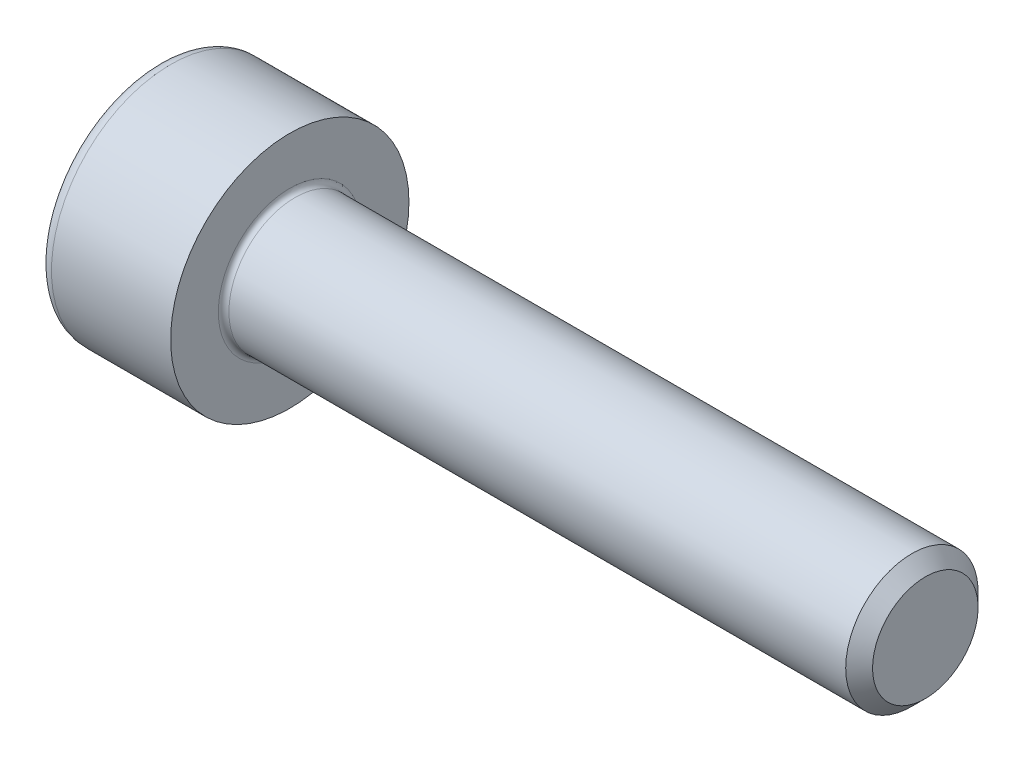
ISO-10303-21;
HEADER;
FILE_DESCRIPTION(('STEP AP214'),'2;1');
FILE_NAME('part.step','',(''),(''),'','','');
FILE_SCHEMA(('AUTOMOTIVE_DESIGN { 1 0 10303 214 1 1 1 1 }'));
ENDSEC;
DATA;
#1=APPLICATION_CONTEXT('core data for automotive mechanical design processes');
#2=APPLICATION_PROTOCOL_DEFINITION('international standard','automotive_design',2000,#1);
#3=PRODUCT_CONTEXT('',#1,'mechanical');
#4=PRODUCT('Part','Part','',(#3));
#5=PRODUCT_RELATED_PRODUCT_CATEGORY('part','',(#4));
#6=PRODUCT_DEFINITION_FORMATION('','',#4);
#7=PRODUCT_DEFINITION_CONTEXT('part definition',#1,'design');
#8=PRODUCT_DEFINITION('design','',#6,#7);
#9=PRODUCT_DEFINITION_SHAPE('','',#8);
#10=(LENGTH_UNIT() NAMED_UNIT(*) SI_UNIT(.MILLI.,.METRE.));
#11=(NAMED_UNIT(*) PLANE_ANGLE_UNIT() SI_UNIT($,.RADIAN.));
#12=(NAMED_UNIT(*) SI_UNIT($,.STERADIAN.) SOLID_ANGLE_UNIT());
#13=UNCERTAINTY_MEASURE_WITH_UNIT(LENGTH_MEASURE(1.E-05),#10,'distance_accuracy_value','');
#14=(GEOMETRIC_REPRESENTATION_CONTEXT(3) GLOBAL_UNCERTAINTY_ASSIGNED_CONTEXT((#13)) GLOBAL_UNIT_ASSIGNED_CONTEXT((#10,
#11,#12)) REPRESENTATION_CONTEXT('',''));
#15=CARTESIAN_POINT('',(0.,0.,0.));
#16=DIRECTION('',(0.,0.,1.));
#17=DIRECTION('',(1.,0.,0.));
#18=AXIS2_PLACEMENT_3D('',#15,#16,#17);
#19=CARTESIAN_POINT('',(1.1,1.15470053837925,0.));
#20=DIRECTION('',(1.,0.,0.));
#21=DIRECTION('',(0.,0.,-1.));
#22=AXIS2_PLACEMENT_3D('',#19,#20,#21);
#23=PLANE('',#22);
#24=CARTESIAN_POINT('',(1.1,0.,0.));
#25=DIRECTION('',(1.,0.,0.));
#26=DIRECTION('',(0.,0.,-1.));
#27=AXIS2_PLACEMENT_3D('',#24,#25,#26);
#28=CIRCLE('',#27,1.);
#29=CARTESIAN_POINT('',(1.1,0.,-0.999999999999999));
#30=VERTEX_POINT('',#29);
#31=CARTESIAN_POINT('',(1.1,-0.866025403784441,-0.5));
#32=VERTEX_POINT('',#31);
#33=EDGE_CURVE('E156',#30,#32,#28,.F.);
#34=ORIENTED_EDGE('',*,*,#33,.F.);
#35=DIRECTION('',(0.,1.,0.));
#36=VECTOR('',#35,1.);
#37=CARTESIAN_POINT('',(1.1,-0.57735026918963,-0.999999999999999));
#38=LINE('',#37,#36);
#39=CARTESIAN_POINT('',(1.1,-0.57735026918963,-0.999999999999999));
#40=VERTEX_POINT('',#39);
#41=EDGE_CURVE('E187',#40,#30,#38,.T.);
#42=ORIENTED_EDGE('',*,*,#41,.F.);
#43=DIRECTION('',(0.,0.499999999999999,-0.866025403784439));
#44=VECTOR('',#43,1.);
#45=CARTESIAN_POINT('',(1.1,-1.15470053837926,0.));
#46=LINE('',#45,#44);
#47=EDGE_CURVE('E183',#32,#40,#46,.T.);
#48=ORIENTED_EDGE('',*,*,#47,.F.);
#49=EDGE_LOOP('',(#34,#42,#48));
#50=FACE_BOUND('',#49,.T.);
#51=ADVANCED_FACE('F34',(#50),#23,.F.);
#52=CARTESIAN_POINT('',(1.1,-0.866025403784442,0.500000000000002));
#53=VERTEX_POINT('',#52);
#54=EDGE_CURVE('E262',#32,#53,#28,.F.);
#55=ORIENTED_EDGE('',*,*,#54,.F.);
#56=CARTESIAN_POINT('',(1.1,-1.15470053837926,0.));
#57=VERTEX_POINT('',#56);
#58=EDGE_CURVE('E184',#57,#32,#46,.T.);
#59=ORIENTED_EDGE('',*,*,#58,.F.);
#60=DIRECTION('',(0.,-0.5,-0.866025403784439));
#61=VECTOR('',#60,1.);
#62=CARTESIAN_POINT('',(1.1,-0.57735026918963,1.));
#63=LINE('',#62,#61);
#64=EDGE_CURVE('E179',#53,#57,#63,.T.);
#65=ORIENTED_EDGE('',*,*,#64,.F.);
#66=EDGE_LOOP('',(#55,#59,#65));
#67=FACE_BOUND('',#66,.T.);
#68=ADVANCED_FACE('F123',(#67),#23,.F.);
#69=CARTESIAN_POINT('',(1.1,0.,1.));
#70=VERTEX_POINT('',#69);
#71=EDGE_CURVE('E263',#53,#70,#28,.F.);
#72=ORIENTED_EDGE('',*,*,#71,.F.);
#73=CARTESIAN_POINT('',(1.1,-0.57735026918963,1.));
#74=VERTEX_POINT('',#73);
#75=EDGE_CURVE('E180',#74,#53,#63,.T.);
#76=ORIENTED_EDGE('',*,*,#75,.F.);
#77=DIRECTION('',(0.,-1.,0.));
#78=VECTOR('',#77,1.);
#79=CARTESIAN_POINT('',(1.1,0.577350269189625,1.));
#80=LINE('',#79,#78);
#81=EDGE_CURVE('E175',#70,#74,#80,.T.);
#82=ORIENTED_EDGE('',*,*,#81,.F.);
#83=EDGE_LOOP('',(#72,#76,#82));
#84=FACE_BOUND('',#83,.T.);
#85=ADVANCED_FACE('F129',(#84),#23,.F.);
#86=CARTESIAN_POINT('',(1.1,0.866025403784438,0.5));
#87=VERTEX_POINT('',#86);
#88=EDGE_CURVE('E265',#70,#87,#28,.F.);
#89=ORIENTED_EDGE('',*,*,#88,.F.);
#90=CARTESIAN_POINT('',(1.1,0.577350269189625,1.));
#91=VERTEX_POINT('',#90);
#92=EDGE_CURVE('E176',#91,#70,#80,.T.);
#93=ORIENTED_EDGE('',*,*,#92,.F.);
#94=DIRECTION('',(0.,-0.5,0.866025403784438));
#95=VECTOR('',#94,1.);
#96=CARTESIAN_POINT('',(1.1,1.15470053837925,0.));
#97=LINE('',#96,#95);
#98=EDGE_CURVE('E170',#87,#91,#97,.T.);
#99=ORIENTED_EDGE('',*,*,#98,.F.);
#100=EDGE_LOOP('',(#89,#93,#99));
#101=FACE_BOUND('',#100,.T.);
#102=ADVANCED_FACE('F144',(#101),#23,.F.);
#103=CARTESIAN_POINT('',(1.1,0.866025403784438,-0.5));
#104=VERTEX_POINT('',#103);
#105=EDGE_CURVE('E49',#87,#104,#28,.F.);
#106=ORIENTED_EDGE('',*,*,#105,.F.);
#107=CARTESIAN_POINT('',(1.1,1.15470053837925,0.));
#108=VERTEX_POINT('',#107);
#109=EDGE_CURVE('E161',#108,#87,#97,.T.);
#110=ORIENTED_EDGE('',*,*,#109,.F.);
#111=DIRECTION('',(0.,0.5,0.866025403784439));
#112=VECTOR('',#111,1.);
#113=CARTESIAN_POINT('',(1.1,0.577350269189627,-0.999999999999998));
#114=LINE('',#113,#112);
#115=EDGE_CURVE('E158',#104,#108,#114,.T.);
#116=ORIENTED_EDGE('',*,*,#115,.F.);
#117=EDGE_LOOP('',(#106,#110,#116));
#118=FACE_BOUND('',#117,.T.);
#119=ADVANCED_FACE('F135',(#118),#23,.F.);
#120=EDGE_CURVE('E148',#104,#30,#28,.F.);
#121=ORIENTED_EDGE('',*,*,#120,.F.);
#122=CARTESIAN_POINT('',(1.1,0.577350269189627,-0.999999999999998));
#123=VERTEX_POINT('',#122);
#124=EDGE_CURVE('E151',#123,#104,#114,.T.);
#125=ORIENTED_EDGE('',*,*,#124,.F.);
#126=EDGE_CURVE('E152',#30,#123,#38,.T.);
#127=ORIENTED_EDGE('',*,*,#126,.F.);
#128=EDGE_LOOP('',(#121,#125,#127));
#129=FACE_BOUND('',#128,.T.);
#130=ADVANCED_FACE('F125',(#129),#23,.F.);
#131=CARTESIAN_POINT('',(0.,0.,0.));
#132=DIRECTION('',(1.,0.,0.));
#133=DIRECTION('',(0.,0.,-1.));
#134=AXIS2_PLACEMENT_3D('',#131,#132,#133);
#135=PLANE('',#134);
#136=CARTESIAN_POINT('',(0.,0.,0.));
#137=DIRECTION('',(1.,0.,0.));
#138=DIRECTION('',(0.,0.,-1.));
#139=AXIS2_PLACEMENT_3D('',#136,#137,#138);
#140=CIRCLE('',#139,2.);
#141=CARTESIAN_POINT('',(0.,0.,-2.));
#142=VERTEX_POINT('',#141);
#143=EDGE_CURVE('E11',#142,#142,#140,.F.);
#144=ORIENTED_EDGE('',*,*,#143,.T.);
#145=EDGE_LOOP('',(#144));
#146=FACE_BOUND('',#145,.T.);
#147=DIRECTION('',(0.,0.5,0.866025403784439));
#148=VECTOR('',#147,1.);
#149=CARTESIAN_POINT('',(0.,0.577350269189627,-0.999999999999998));
#150=LINE('',#149,#148);
#151=CARTESIAN_POINT('',(0.,0.577350269189627,-0.999999999999998));
#152=VERTEX_POINT('',#151);
#153=CARTESIAN_POINT('',(0.,1.15470053837925,0.));
#154=VERTEX_POINT('',#153);
#155=EDGE_CURVE('E189',#152,#154,#150,.T.);
#156=ORIENTED_EDGE('',*,*,#155,.T.);
#157=DIRECTION('',(0.,-0.5,0.866025403784438));
#158=VECTOR('',#157,1.);
#159=CARTESIAN_POINT('',(0.,1.15470053837925,0.));
#160=LINE('',#159,#158);
#161=CARTESIAN_POINT('',(0.,0.577350269189625,1.));
#162=VERTEX_POINT('',#161);
#163=EDGE_CURVE('E191',#154,#162,#160,.T.);
#164=ORIENTED_EDGE('',*,*,#163,.T.);
#165=DIRECTION('',(0.,-1.,0.));
#166=VECTOR('',#165,1.);
#167=CARTESIAN_POINT('',(0.,0.577350269189625,1.));
#168=LINE('',#167,#166);
#169=CARTESIAN_POINT('',(0.,-0.57735026918963,1.));
#170=VERTEX_POINT('',#169);
#171=EDGE_CURVE('E193',#162,#170,#168,.T.);
#172=ORIENTED_EDGE('',*,*,#171,.T.);
#173=DIRECTION('',(0.,-0.5,-0.866025403784439));
#174=VECTOR('',#173,1.);
#175=CARTESIAN_POINT('',(0.,-0.57735026918963,1.));
#176=LINE('',#175,#174);
#177=CARTESIAN_POINT('',(0.,-1.15470053837926,0.));
#178=VERTEX_POINT('',#177);
#179=EDGE_CURVE('E195',#170,#178,#176,.T.);
#180=ORIENTED_EDGE('',*,*,#179,.T.);
#181=DIRECTION('',(0.,0.499999999999999,-0.866025403784439));
#182=VECTOR('',#181,1.);
#183=CARTESIAN_POINT('',(0.,-1.15470053837926,0.));
#184=LINE('',#183,#182);
#185=CARTESIAN_POINT('',(0.,-0.57735026918963,-0.999999999999999));
#186=VERTEX_POINT('',#185);
#187=EDGE_CURVE('E197',#178,#186,#184,.T.);
#188=ORIENTED_EDGE('',*,*,#187,.T.);
#189=DIRECTION('',(0.,1.,0.));
#190=VECTOR('',#189,1.);
#191=CARTESIAN_POINT('',(0.,-0.57735026918963,-0.999999999999999));
#192=LINE('',#191,#190);
#193=EDGE_CURVE('E57',#186,#152,#192,.T.);
#194=ORIENTED_EDGE('',*,*,#193,.T.);
#195=EDGE_LOOP('',(#156,#164,#172,#180,#188,#194));
#196=FACE_BOUND('',#195,.T.);
#197=ADVANCED_FACE('F134',(#146,#196),#135,.F.);
#198=CARTESIAN_POINT('',(2.5,0.,0.));
#199=DIRECTION('',(1.,0.,0.));
#200=DIRECTION('',(0.,0.,-1.));
#201=AXIS2_PLACEMENT_3D('',#198,#199,#200);
#202=PLANE('',#201);
#203=CARTESIAN_POINT('',(2.5,0.,0.));
#204=DIRECTION('',(1.,0.,0.));
#205=DIRECTION('',(0.,0.,-1.));
#206=AXIS2_PLACEMENT_3D('',#203,#204,#205);
#207=CIRCLE('',#206,1.35);
#208=CARTESIAN_POINT('',(2.5,0.,-1.35));
#209=VERTEX_POINT('',#208);
#210=EDGE_CURVE('E223',#209,#209,#207,.F.);
#211=ORIENTED_EDGE('',*,*,#210,.T.);
#212=EDGE_LOOP('',(#211));
#213=FACE_BOUND('',#212,.T.);
#214=CARTESIAN_POINT('',(2.5,0.,0.));
#215=DIRECTION('',(1.,0.,0.));
#216=DIRECTION('',(0.,0.,-1.));
#217=AXIS2_PLACEMENT_3D('',#214,#215,#216);
#218=CIRCLE('',#217,2.25);
#219=CARTESIAN_POINT('',(2.5,0.,-2.25));
#220=VERTEX_POINT('',#219);
#221=EDGE_CURVE('E154',#220,#220,#218,.T.);
#222=ORIENTED_EDGE('',*,*,#221,.T.);
#223=EDGE_LOOP('',(#222));
#224=FACE_BOUND('',#223,.T.);
#225=ADVANCED_FACE('F141',(#213,#224),#202,.T.);
#226=CARTESIAN_POINT('',(2.5,0.,0.));
#227=DIRECTION('',(-1.,0.,0.));
#228=DIRECTION('',(0.,0.,1.));
#229=AXIS2_PLACEMENT_3D('',#226,#227,#228);
#230=CYLINDRICAL_SURFACE('',#229,2.25);
#231=CARTESIAN_POINT('',(0.25,0.,0.));
#232=DIRECTION('',(1.,0.,0.));
#233=DIRECTION('',(0.,0.,-1.));
#234=AXIS2_PLACEMENT_3D('',#231,#232,#233);
#235=CIRCLE('',#234,2.25);
#236=CARTESIAN_POINT('',(0.25,0.,-2.25));
#237=VERTEX_POINT('',#236);
#238=EDGE_CURVE('E42',#237,#237,#235,.T.);
#239=ORIENTED_EDGE('',*,*,#238,.T.);
#240=EDGE_LOOP('',(#239));
#241=FACE_BOUND('',#240,.T.);
#242=ORIENTED_EDGE('',*,*,#221,.F.);
#243=EDGE_LOOP('',(#242));
#244=FACE_BOUND('',#243,.T.);
#245=ADVANCED_FACE('F231',(#241,#244),#230,.T.);
#246=CARTESIAN_POINT('',(14.5,0.,0.));
#247=DIRECTION('',(-1.,0.,0.));
#248=DIRECTION('',(0.,0.,1.));
#249=AXIS2_PLACEMENT_3D('',#246,#247,#248);
#250=PLANE('',#249);
#251=CARTESIAN_POINT('',(14.5,0.,0.));
#252=DIRECTION('',(-1.,0.,0.));
#253=DIRECTION('',(0.,0.,1.));
#254=AXIS2_PLACEMENT_3D('',#251,#252,#253);
#255=CIRCLE('',#254,0.9965);
#256=CARTESIAN_POINT('',(14.5,0.,0.9965));
#257=VERTEX_POINT('',#256);
#258=EDGE_CURVE('E218',#257,#257,#255,.T.);
#259=ORIENTED_EDGE('',*,*,#258,.F.);
#260=EDGE_LOOP('',(#259));
#261=FACE_BOUND('',#260,.T.);
#262=ADVANCED_FACE('F388',(#261),#250,.F.);
#263=CARTESIAN_POINT('',(14.5,0.,0.));
#264=DIRECTION('',(-1.,0.,0.));
#265=DIRECTION('',(0.,0.,1.));
#266=AXIS2_PLACEMENT_3D('',#263,#264,#265);
#267=CONICAL_SURFACE('',#266,0.9965,0.785398163397444);
#268=CARTESIAN_POINT('',(14.2465,0.,0.));
#269=DIRECTION('',(-1.,0.,0.));
#270=DIRECTION('',(0.,0.,1.));
#271=AXIS2_PLACEMENT_3D('',#268,#269,#270);
#272=CIRCLE('',#271,1.25);
#273=CARTESIAN_POINT('',(14.2465,0.,1.25));
#274=VERTEX_POINT('',#273);
#275=EDGE_CURVE('E215',#274,#274,#272,.T.);
#276=ORIENTED_EDGE('',*,*,#275,.F.);
#277=EDGE_LOOP('',(#276));
#278=FACE_BOUND('',#277,.T.);
#279=ORIENTED_EDGE('',*,*,#258,.T.);
#280=EDGE_LOOP('',(#279));
#281=FACE_BOUND('',#280,.T.);
#282=ADVANCED_FACE('F368',(#278,#281),#267,.T.);
#283=CARTESIAN_POINT('',(0.,0.,0.));
#284=DIRECTION('',(-1.,0.,0.));
#285=DIRECTION('',(0.,0.,1.));
#286=AXIS2_PLACEMENT_3D('',#283,#284,#285);
#287=CYLINDRICAL_SURFACE('',#286,1.25);
#288=CARTESIAN_POINT('',(2.6,0.,0.));
#289=DIRECTION('',(1.,0.,0.));
#290=DIRECTION('',(0.,0.,-1.));
#291=AXIS2_PLACEMENT_3D('',#288,#289,#290);
#292=CIRCLE('',#291,1.25);
#293=CARTESIAN_POINT('',(2.6,0.,-1.25));
#294=VERTEX_POINT('',#293);
#295=EDGE_CURVE('E226',#294,#294,#292,.T.);
#296=ORIENTED_EDGE('',*,*,#295,.T.);
#297=EDGE_LOOP('',(#296));
#298=FACE_BOUND('',#297,.T.);
#299=ORIENTED_EDGE('',*,*,#275,.T.);
#300=EDGE_LOOP('',(#299));
#301=FACE_BOUND('',#300,.T.);
#302=ADVANCED_FACE('F295',(#298,#301),#287,.T.);
#303=CARTESIAN_POINT('',(1.1,0.577350269189627,-0.999999999999998));
#304=DIRECTION('',(0.,-0.866025403784439,0.5));
#305=DIRECTION('',(0.,-0.5,-0.866025403784439));
#306=AXIS2_PLACEMENT_3D('',#303,#304,#305);
#307=PLANE('',#306);
#308=ORIENTED_EDGE('',*,*,#124,.T.);
#309=ORIENTED_EDGE('',*,*,#115,.T.);
#310=DIRECTION('',(-1.,0.,0.));
#311=VECTOR('',#310,1.);
#312=CARTESIAN_POINT('',(1.1,1.15470053837925,0.));
#313=LINE('',#312,#311);
#314=EDGE_CURVE('E213',#108,#154,#313,.T.);
#315=ORIENTED_EDGE('',*,*,#314,.T.);
#316=ORIENTED_EDGE('',*,*,#155,.F.);
#317=DIRECTION('',(-1.,0.,0.));
#318=VECTOR('',#317,1.);
#319=CARTESIAN_POINT('',(1.1,0.577350269189627,-0.999999999999998));
#320=LINE('',#319,#318);
#321=EDGE_CURVE('E169',#123,#152,#320,.T.);
#322=ORIENTED_EDGE('',*,*,#321,.F.);
#323=EDGE_LOOP('',(#308,#309,#315,#316,#322));
#324=FACE_BOUND('',#323,.T.);
#325=ADVANCED_FACE('F167',(#324),#307,.T.);
#326=CARTESIAN_POINT('',(1.1,1.15470053837925,0.));
#327=DIRECTION('',(0.,-0.866025403784439,-0.5));
#328=DIRECTION('',(0.,0.5,-0.866025403784439));
#329=AXIS2_PLACEMENT_3D('',#326,#327,#328);
#330=PLANE('',#329);
#331=ORIENTED_EDGE('',*,*,#109,.T.);
#332=ORIENTED_EDGE('',*,*,#98,.T.);
#333=DIRECTION('',(-1.,0.,0.));
#334=VECTOR('',#333,1.);
#335=CARTESIAN_POINT('',(1.1,0.577350269189625,1.));
#336=LINE('',#335,#334);
#337=EDGE_CURVE('E210',#91,#162,#336,.T.);
#338=ORIENTED_EDGE('',*,*,#337,.T.);
#339=ORIENTED_EDGE('',*,*,#163,.F.);
#340=ORIENTED_EDGE('',*,*,#314,.F.);
#341=EDGE_LOOP('',(#331,#332,#338,#339,#340));
#342=FACE_BOUND('',#341,.T.);
#343=ADVANCED_FACE('F241',(#342),#330,.T.);
#344=CARTESIAN_POINT('',(1.1,0.577350269189625,1.));
#345=DIRECTION('',(0.,0.,-1.));
#346=DIRECTION('',(0.,1.,0.));
#347=AXIS2_PLACEMENT_3D('',#344,#345,#346);
#348=PLANE('',#347);
#349=ORIENTED_EDGE('',*,*,#92,.T.);
#350=ORIENTED_EDGE('',*,*,#81,.T.);
#351=DIRECTION('',(-1.,0.,0.));
#352=VECTOR('',#351,1.);
#353=CARTESIAN_POINT('',(1.1,-0.57735026918963,1.));
#354=LINE('',#353,#352);
#355=EDGE_CURVE('E207',#74,#170,#354,.T.);
#356=ORIENTED_EDGE('',*,*,#355,.T.);
#357=ORIENTED_EDGE('',*,*,#171,.F.);
#358=ORIENTED_EDGE('',*,*,#337,.F.);
#359=EDGE_LOOP('',(#349,#350,#356,#357,#358));
#360=FACE_BOUND('',#359,.T.);
#361=ADVANCED_FACE('F246',(#360),#348,.T.);
#362=CARTESIAN_POINT('',(1.1,-0.57735026918963,1.));
#363=DIRECTION('',(0.,0.866025403784439,-0.5));
#364=DIRECTION('',(0.,0.5,0.866025403784439));
#365=AXIS2_PLACEMENT_3D('',#362,#363,#364);
#366=PLANE('',#365);
#367=ORIENTED_EDGE('',*,*,#75,.T.);
#368=ORIENTED_EDGE('',*,*,#64,.T.);
#369=DIRECTION('',(-1.,0.,0.));
#370=VECTOR('',#369,1.);
#371=CARTESIAN_POINT('',(1.1,-1.15470053837926,0.));
#372=LINE('',#371,#370);
#373=EDGE_CURVE('E204',#57,#178,#372,.T.);
#374=ORIENTED_EDGE('',*,*,#373,.T.);
#375=ORIENTED_EDGE('',*,*,#179,.F.);
#376=ORIENTED_EDGE('',*,*,#355,.F.);
#377=EDGE_LOOP('',(#367,#368,#374,#375,#376));
#378=FACE_BOUND('',#377,.T.);
#379=ADVANCED_FACE('F252',(#378),#366,.T.);
#380=CARTESIAN_POINT('',(1.1,-1.15470053837926,0.));
#381=DIRECTION('',(0.,0.866025403784439,0.499999999999999));
#382=DIRECTION('',(0.,-0.499999999999999,0.866025403784439));
#383=AXIS2_PLACEMENT_3D('',#380,#381,#382);
#384=PLANE('',#383);
#385=ORIENTED_EDGE('',*,*,#58,.T.);
#386=ORIENTED_EDGE('',*,*,#47,.T.);
#387=DIRECTION('',(-1.,0.,0.));
#388=VECTOR('',#387,1.);
#389=CARTESIAN_POINT('',(1.1,-0.57735026918963,-0.999999999999999));
#390=LINE('',#389,#388);
#391=EDGE_CURVE('E201',#40,#186,#390,.T.);
#392=ORIENTED_EDGE('',*,*,#391,.T.);
#393=ORIENTED_EDGE('',*,*,#187,.F.);
#394=ORIENTED_EDGE('',*,*,#373,.F.);
#395=EDGE_LOOP('',(#385,#386,#392,#393,#394));
#396=FACE_BOUND('',#395,.T.);
#397=ADVANCED_FACE('F256',(#396),#384,.T.);
#398=CARTESIAN_POINT('',(1.1,-0.57735026918963,-0.999999999999999));
#399=DIRECTION('',(0.,0.,1.));
#400=DIRECTION('',(0.,-1.,0.));
#401=AXIS2_PLACEMENT_3D('',#398,#399,#400);
#402=PLANE('',#401);
#403=ORIENTED_EDGE('',*,*,#41,.T.);
#404=ORIENTED_EDGE('',*,*,#126,.T.);
#405=ORIENTED_EDGE('',*,*,#321,.T.);
#406=ORIENTED_EDGE('',*,*,#193,.F.);
#407=ORIENTED_EDGE('',*,*,#391,.F.);
#408=EDGE_LOOP('',(#403,#404,#405,#406,#407));
#409=FACE_BOUND('',#408,.T.);
#410=ADVANCED_FACE('F117',(#409),#402,.T.);
#411=CARTESIAN_POINT('',(0.,0.,0.));
#412=DIRECTION('',(-1.,0.,0.));
#413=DIRECTION('',(0.,0.,1.));
#414=AXIS2_PLACEMENT_3D('',#411,#412,#413);
#415=CYLINDRICAL_SURFACE('',#414,1.);
#416=CARTESIAN_POINT('',(1.65,0.,0.));
#417=DIRECTION('',(-1.,0.,0.));
#418=DIRECTION('',(0.,0.,1.));
#419=AXIS2_PLACEMENT_3D('',#416,#417,#418);
#420=CIRCLE('',#419,1.);
#421=CARTESIAN_POINT('',(1.65,0.,1.));
#422=VERTEX_POINT('',#421);
#423=EDGE_CURVE('E173',#422,#422,#420,.T.);
#424=ORIENTED_EDGE('',*,*,#423,.F.);
#425=EDGE_LOOP('',(#424));
#426=FACE_BOUND('',#425,.T.);
#427=ORIENTED_EDGE('',*,*,#33,.T.);
#428=ORIENTED_EDGE('',*,*,#54,.T.);
#429=ORIENTED_EDGE('',*,*,#71,.T.);
#430=ORIENTED_EDGE('',*,*,#88,.T.);
#431=ORIENTED_EDGE('',*,*,#105,.T.);
#432=ORIENTED_EDGE('',*,*,#120,.T.);
#433=EDGE_LOOP('',(#427,#428,#429,#430,#431,#432));
#434=FACE_BOUND('',#433,.T.);
#435=ADVANCED_FACE('F109',(#426,#434),#415,.F.);
#436=CARTESIAN_POINT('',(2.22735026918963,0.,0.));
#437=DIRECTION('',(-1.,0.,0.));
#438=DIRECTION('',(0.,0.,1.));
#439=AXIS2_PLACEMENT_3D('',#436,#437,#438);
#440=CONICAL_SURFACE('',#439,0.,1.04719755119659);
#441=ORIENTED_EDGE('',*,*,#423,.T.);
#442=EDGE_LOOP('',(#441));
#443=FACE_BOUND('',#442,.T.);
#444=CARTESIAN_POINT('',(2.22735026918963,0.,0.));
#445=VERTEX_POINT('',#444);
#446=VERTEX_LOOP('',#445);
#447=FACE_BOUND('',#446,.T.);
#448=ADVANCED_FACE('F106',(#443,#447),#440,.F.);
#449=CARTESIAN_POINT('',(2.6,0.,0.));
#450=DIRECTION('',(1.,0.,0.));
#451=DIRECTION('',(0.,0.,-1.));
#452=AXIS2_PLACEMENT_3D('',#449,#450,#451);
#453=TOROIDAL_SURFACE('',#452,1.35,0.1);
#454=ORIENTED_EDGE('',*,*,#295,.F.);
#455=EDGE_LOOP('',(#454));
#456=FACE_BOUND('',#455,.T.);
#457=ORIENTED_EDGE('',*,*,#210,.F.);
#458=EDGE_LOOP('',(#457));
#459=FACE_BOUND('',#458,.T.);
#460=ADVANCED_FACE('F108',(#456,#459),#453,.F.);
#461=CARTESIAN_POINT('',(0.25,0.,0.));
#462=DIRECTION('',(1.,0.,0.));
#463=DIRECTION('',(0.,0.,-1.));
#464=AXIS2_PLACEMENT_3D('',#461,#462,#463);
#465=TOROIDAL_SURFACE('',#464,2.,0.25);
#466=ORIENTED_EDGE('',*,*,#143,.F.);
#467=EDGE_LOOP('',(#466));
#468=FACE_BOUND('',#467,.T.);
#469=ORIENTED_EDGE('',*,*,#238,.F.);
#470=EDGE_LOOP('',(#469));
#471=FACE_BOUND('',#470,.T.);
#472=ADVANCED_FACE('F36',(#468,#471),#465,.T.);
#473=CLOSED_SHELL('',(#51,#68,#85,#102,#119,#130,#197,#225,#245,#262,#282,#302,#325,#343,#361,
#379,#397,#410,#435,#448,#460,#472));
#474=MANIFOLD_SOLID_BREP('B2',#473);
#475=ADVANCED_BREP_SHAPE_REPRESENTATION('',(#18,#474),#14);
#476=SHAPE_DEFINITION_REPRESENTATION(#9,#475);
ENDSEC;
END-ISO-10303-21;
